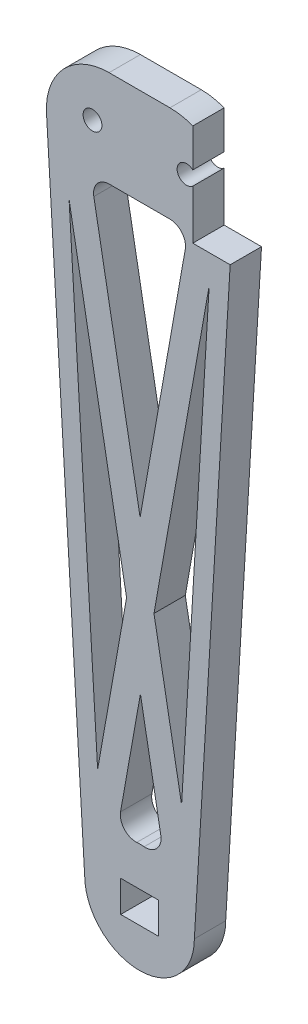
ISO-10303-21;
HEADER;
FILE_DESCRIPTION(('STEP AP214'),'2;1');
FILE_NAME('part.step','',(''),(''),'','','');
FILE_SCHEMA(('AUTOMOTIVE_DESIGN { 1 0 10303 214 1 1 1 1 }'));
ENDSEC;
DATA;
#1=APPLICATION_CONTEXT('core data for automotive mechanical design processes');
#2=APPLICATION_PROTOCOL_DEFINITION('international standard','automotive_design',2000,#1);
#3=PRODUCT_CONTEXT('',#1,'mechanical');
#4=PRODUCT('Part','Part','',(#3));
#5=PRODUCT_RELATED_PRODUCT_CATEGORY('part','',(#4));
#6=PRODUCT_DEFINITION_FORMATION('','',#4);
#7=PRODUCT_DEFINITION_CONTEXT('part definition',#1,'design');
#8=PRODUCT_DEFINITION('design','',#6,#7);
#9=PRODUCT_DEFINITION_SHAPE('','',#8);
#10=(LENGTH_UNIT() NAMED_UNIT(*) SI_UNIT(.MILLI.,.METRE.));
#11=(NAMED_UNIT(*) PLANE_ANGLE_UNIT() SI_UNIT($,.RADIAN.));
#12=(NAMED_UNIT(*) SI_UNIT($,.STERADIAN.) SOLID_ANGLE_UNIT());
#13=UNCERTAINTY_MEASURE_WITH_UNIT(LENGTH_MEASURE(1.E-05),#10,'distance_accuracy_value','');
#14=(GEOMETRIC_REPRESENTATION_CONTEXT(3) GLOBAL_UNCERTAINTY_ASSIGNED_CONTEXT((#13)) GLOBAL_UNIT_ASSIGNED_CONTEXT((#10,
#11,#12)) REPRESENTATION_CONTEXT('',''));
#15=CARTESIAN_POINT('',(0.,0.,0.));
#16=DIRECTION('',(0.,0.,1.));
#17=DIRECTION('',(1.,0.,0.));
#18=AXIS2_PLACEMENT_3D('',#15,#16,#17);
#19=CARTESIAN_POINT('',(0.,0.,10.));
#20=DIRECTION('',(0.,0.,1.));
#21=DIRECTION('',(1.,0.,0.));
#22=AXIS2_PLACEMENT_3D('',#19,#20,#21);
#23=PLANE('',#22);
#24=CARTESIAN_POINT('',(-15.,0.,10.));
#25=DIRECTION('',(0.,0.,1.));
#26=DIRECTION('',(1.,0.,0.));
#27=AXIS2_PLACEMENT_3D('',#24,#25,#26);
#28=CIRCLE('',#27,3.);
#29=CARTESIAN_POINT('',(-12.,0.,10.));
#30=VERTEX_POINT('',#29);
#31=EDGE_CURVE('E441',#30,#30,#28,.T.);
#32=ORIENTED_EDGE('',*,*,#31,.F.);
#33=EDGE_LOOP('',(#32));
#34=FACE_BOUND('',#33,.T.);
#35=DIRECTION('',(0.,1.,0.));
#36=VECTOR('',#35,1.);
#37=CARTESIAN_POINT('',(-6.00000000000001,0.,10.));
#38=LINE('',#37,#36);
#39=CARTESIAN_POINT('',(-6.00000000000001,-215.,10.));
#40=VERTEX_POINT('',#39);
#41=CARTESIAN_POINT('',(-6.00000000000001,-205.,10.));
#42=VERTEX_POINT('',#41);
#43=EDGE_CURVE('E444',#40,#42,#38,.T.);
#44=ORIENTED_EDGE('',*,*,#43,.T.);
#45=DIRECTION('',(1.,0.,0.));
#46=VECTOR('',#45,1.);
#47=CARTESIAN_POINT('',(4.74157750100327E-13,-205.,10.));
#48=LINE('',#47,#46);
#49=CARTESIAN_POINT('',(6.,-205.,10.));
#50=VERTEX_POINT('',#49);
#51=EDGE_CURVE('E447',#42,#50,#48,.T.);
#52=ORIENTED_EDGE('',*,*,#51,.T.);
#53=DIRECTION('',(0.,1.,0.));
#54=VECTOR('',#53,1.);
#55=CARTESIAN_POINT('',(5.99999999999989,0.,10.));
#56=LINE('',#55,#54);
#57=CARTESIAN_POINT('',(6.00000000000001,-215.,10.));
#58=VERTEX_POINT('',#57);
#59=EDGE_CURVE('E449',#58,#50,#56,.T.);
#60=ORIENTED_EDGE('',*,*,#59,.F.);
#61=DIRECTION('',(1.,0.,0.));
#62=VECTOR('',#61,1.);
#63=CARTESIAN_POINT('',(-4.97287396446684E-13,-215.,10.));
#64=LINE('',#63,#62);
#65=EDGE_CURVE('E452',#40,#58,#64,.T.);
#66=ORIENTED_EDGE('',*,*,#65,.F.);
#67=EDGE_LOOP('',(#44,#52,#60,#66));
#68=FACE_BOUND('',#67,.T.);
#69=DIRECTION('',(0.174574666070561,0.984643938673444,0.));
#70=VECTOR('',#69,1.);
#71=CARTESIAN_POINT('',(17.7452712206691,-3.14618785126878,10.));
#72=LINE('',#71,#70);
#73=CARTESIAN_POINT('',(0.190220551076297,-102.160979768059,10.));
#74=VERTEX_POINT('',#73);
#75=CARTESIAN_POINT('',(14.6023785703389,-20.8728733303528,10.));
#76=VERTEX_POINT('',#75);
#77=EDGE_CURVE('E419',#74,#76,#72,.T.);
#78=ORIENTED_EDGE('',*,*,#77,.F.);
#79=DIRECTION('',(-0.178826073356073,0.983880701857724,0.));
#80=VECTOR('',#79,1.);
#81=CARTESIAN_POINT('',(-17.7904251161172,-3.23351384049256,10.));
#82=LINE('',#81,#80);
#83=CARTESIAN_POINT('',(-14.5805047462184,-20.8941303667804,10.));
#84=VERTEX_POINT('',#83);
#85=EDGE_CURVE('E379',#74,#84,#82,.T.);
#86=ORIENTED_EDGE('',*,*,#85,.T.);
#87=CARTESIAN_POINT('',(-9.66110123692979,-20.,10.));
#88=DIRECTION('',(0.,0.,1.));
#89=DIRECTION('',(1.,0.,0.));
#90=AXIS2_PLACEMENT_3D('',#87,#88,#89);
#91=CIRCLE('',#90,5.);
#92=CARTESIAN_POINT('',(-9.66110123692979,-15.,10.));
#93=VERTEX_POINT('',#92);
#94=EDGE_CURVE('E539',#84,#93,#91,.F.);
#95=ORIENTED_EDGE('',*,*,#94,.T.);
#96=DIRECTION('',(1.,0.,0.));
#97=VECTOR('',#96,1.);
#98=CARTESIAN_POINT('',(0.,-15.,10.));
#99=LINE('',#98,#97);
#100=CARTESIAN_POINT('',(9.67915887697167,-15.,10.));
#101=VERTEX_POINT('',#100);
#102=EDGE_CURVE('E410',#93,#101,#99,.T.);
#103=ORIENTED_EDGE('',*,*,#102,.T.);
#104=CARTESIAN_POINT('',(9.67915887697167,-20.,10.));
#105=DIRECTION('',(0.,0.,1.));
#106=DIRECTION('',(1.,0.,0.));
#107=AXIS2_PLACEMENT_3D('',#104,#105,#106);
#108=CIRCLE('',#107,5.);
#109=EDGE_CURVE('E115',#101,#76,#108,.F.);
#110=ORIENTED_EDGE('',*,*,#109,.T.);
#111=EDGE_LOOP('',(#78,#86,#95,#103,#110));
#112=FACE_BOUND('',#111,.T.);
#113=DIRECTION('',(-0.178826073356073,0.983880701857724,0.));
#114=VECTOR('',#113,1.);
#115=CARTESIAN_POINT('',(-26.2678721622271,-4.77433943497515,10.));
#116=LINE('',#115,#114);
#117=CARTESIAN_POINT('',(6.79531038371948,-186.684206595022,10.));
#118=VERTEX_POINT('',#117);
#119=CARTESIAN_POINT('',(0.29160959832128,-150.901585116392,10.));
#120=VERTEX_POINT('',#119);
#121=EDGE_CURVE('E351',#118,#120,#116,.T.);
#122=ORIENTED_EDGE('',*,*,#121,.F.);
#123=CARTESIAN_POINT('',(1.87590687443086,-187.578336961803,10.));
#124=DIRECTION('',(0.,0.,1.));
#125=DIRECTION('',(1.,0.,0.));
#126=AXIS2_PLACEMENT_3D('',#123,#124,#125);
#127=CIRCLE('',#126,5.);
#128=CARTESIAN_POINT('',(1.45903868011289,-192.560928748069,10.));
#129=VERTEX_POINT('',#128);
#130=EDGE_CURVE('E531',#118,#129,#127,.F.);
#131=ORIENTED_EDGE('',*,*,#130,.T.);
#132=CARTESIAN_POINT('',(0.,-210.,10.));
#133=DIRECTION('',(0.,0.,1.));
#134=DIRECTION('',(1.,0.,0.));
#135=AXIS2_PLACEMENT_3D('',#132,#133,#134);
#136=CIRCLE('',#135,17.5);
#137=CARTESIAN_POINT('',(-0.874372767581587,-192.521857299378,10.));
#138=VERTEX_POINT('',#137);
#139=EDGE_CURVE('E332',#129,#138,#136,.T.);
#140=ORIENTED_EDGE('',*,*,#139,.T.);
#141=CARTESIAN_POINT('',(-1.12419355831918,-187.528102242057,10.));
#142=DIRECTION('',(0.,0.,1.));
#143=DIRECTION('',(1.,0.,0.));
#144=AXIS2_PLACEMENT_3D('',#141,#142,#143);
#145=CIRCLE('',#144,5.);
#146=CARTESIAN_POINT('',(-6.0474132516864,-186.655228911704,10.));
#147=VERTEX_POINT('',#146);
#148=EDGE_CURVE('E535',#138,#147,#145,.F.);
#149=ORIENTED_EDGE('',*,*,#148,.T.);
#150=DIRECTION('',(0.174574666070561,0.984643938673444,0.));
#151=VECTOR('',#150,1.);
#152=CARTESIAN_POINT('',(26.2217824014059,-4.64905000346376,10.));
#153=LINE('',#152,#151);
#154=EDGE_CURVE('E343',#147,#120,#153,.T.);
#155=ORIENTED_EDGE('',*,*,#154,.T.);
#156=EDGE_LOOP('',(#122,#131,#140,#149,#155));
#157=FACE_BOUND('',#156,.T.);
#158=DIRECTION('',(-0.178826073356073,0.983880701857724,0.));
#159=VECTOR('',#158,1.);
#160=CARTESIAN_POINT('',(-17.7904251161172,-3.23351384049256,10.));
#161=LINE('',#160,#159);
#162=CARTESIAN_POINT('',(13.4301626709257,-175.005634358752,10.));
#163=VERTEX_POINT('',#162);
#164=CARTESIAN_POINT('',(4.61598635326493,-126.511039476885,10.));
#165=VERTEX_POINT('',#164);
#166=EDGE_CURVE('E395',#163,#165,#161,.T.);
#167=ORIENTED_EDGE('',*,*,#166,.T.);
#168=DIRECTION('',(0.174574666070561,0.984643938673444,0.));
#169=VECTOR('',#168,1.);
#170=CARTESIAN_POINT('',(26.2217824014059,-4.64905000346376,10.));
#171=LINE('',#170,#169);
#172=CARTESIAN_POINT('',(22.2304198411749,-27.1613138985647,10.));
#173=VERTEX_POINT('',#172);
#174=EDGE_CURVE('E357',#165,#173,#171,.T.);
#175=ORIENTED_EDGE('',*,*,#174,.T.);
#176=DIRECTION('',(-0.0594186399842153,-0.998233151734817,0.));
#177=VECTOR('',#176,1.);
#178=CARTESIAN_POINT('',(23.7629705178262,-1.41446253082299,10.));
#179=LINE('',#178,#177);
#180=EDGE_CURVE('E387',#173,#163,#179,.T.);
#181=ORIENTED_EDGE('',*,*,#180,.T.);
#182=EDGE_LOOP('',(#167,#175,#181));
#183=FACE_BOUND('',#182,.T.);
#184=DIRECTION('',(0.174574666070561,0.984643938673444,0.));
#185=VECTOR('',#184,1.);
#186=CARTESIAN_POINT('',(17.7452712206691,-3.14618785126878,10.));
#187=LINE('',#186,#185);
#188=CARTESIAN_POINT('',(-13.367328464566,-178.628881795291,10.));
#189=VERTEX_POINT('',#188);
#190=CARTESIAN_POINT('',(-4.13415620386734,-126.551525407566,10.));
#191=VERTEX_POINT('',#190);
#192=EDGE_CURVE('E371',#189,#191,#187,.T.);
#193=ORIENTED_EDGE('',*,*,#192,.F.);
#194=DIRECTION('',(-0.0594186399842153,0.998233151734817,0.));
#195=VECTOR('',#194,1.);
#196=CARTESIAN_POINT('',(-23.9152662053382,-1.42352775031775,10.));
#197=LINE('',#196,#195);
#198=CARTESIAN_POINT('',(-22.4730270714025,-25.6531452004381,10.));
#199=VERTEX_POINT('',#198);
#200=EDGE_CURVE('E368',#189,#199,#197,.T.);
#201=ORIENTED_EDGE('',*,*,#200,.T.);
#202=DIRECTION('',(-0.178826073356073,0.983880701857724,0.));
#203=VECTOR('',#202,1.);
#204=CARTESIAN_POINT('',(-26.2678721622271,-4.77433943497515,10.));
#205=LINE('',#204,#203);
#206=EDGE_CURVE('E361',#191,#199,#205,.T.);
#207=ORIENTED_EDGE('',*,*,#206,.F.);
#208=EDGE_LOOP('',(#193,#201,#207));
#209=FACE_BOUND('',#208,.T.);
#210=CARTESIAN_POINT('',(15.,0.,10.));
#211=DIRECTION('',(0.,0.,1.));
#212=DIRECTION('',(1.,0.,0.));
#213=AXIS2_PLACEMENT_3D('',#210,#211,#212);
#214=CIRCLE('',#213,3.);
#215=CARTESIAN_POINT('',(17.,2.23606797749979,10.));
#216=VERTEX_POINT('',#215);
#217=CARTESIAN_POINT('',(17.,-2.23606797749979,10.));
#218=VERTEX_POINT('',#217);
#219=EDGE_CURVE('E438',#216,#218,#214,.T.);
#220=ORIENTED_EDGE('',*,*,#219,.F.);
#221=DIRECTION('',(0.,1.,0.));
#222=VECTOR('',#221,1.);
#223=CARTESIAN_POINT('',(17.,0.,10.));
#224=LINE('',#223,#222);
#225=CARTESIAN_POINT('',(17.,14.395591770238,10.));
#226=VERTEX_POINT('',#225);
#227=EDGE_CURVE('E321',#216,#226,#224,.T.);
#228=ORIENTED_EDGE('',*,*,#227,.T.);
#229=CARTESIAN_POINT('',(9.71283934950197,-4.22958714578407,10.));
#230=DIRECTION('',(0.,0.,1.));
#231=DIRECTION('',(1.,0.,0.));
#232=AXIS2_PLACEMENT_3D('',#229,#230,#231);
#233=CIRCLE('',#232,20.);
#234=CARTESIAN_POINT('',(9.71283934950197,15.7704128542159,10.));
#235=VERTEX_POINT('',#234);
#236=EDGE_CURVE('E509',#226,#235,#233,.T.);
#237=ORIENTED_EDGE('',*,*,#236,.T.);
#238=DIRECTION('',(1.,0.,0.));
#239=VECTOR('',#238,1.);
#240=CARTESIAN_POINT('',(0.,15.7704128542159,10.));
#241=LINE('',#240,#239);
#242=CARTESIAN_POINT('',(-9.71283934950197,15.7704128542159,10.));
#243=VERTEX_POINT('',#242);
#244=EDGE_CURVE('E435',#243,#235,#241,.T.);
#245=ORIENTED_EDGE('',*,*,#244,.F.);
#246=CARTESIAN_POINT('',(-9.71283934950197,-4.22958714578407,10.));
#247=DIRECTION('',(0.,0.,1.));
#248=DIRECTION('',(1.,0.,0.));
#249=AXIS2_PLACEMENT_3D('',#246,#247,#248);
#250=CIRCLE('',#249,20.);
#251=CARTESIAN_POINT('',(-29.6775023841983,-5.41795994546837,10.));
#252=VERTEX_POINT('',#251);
#253=EDGE_CURVE('E501',#243,#252,#250,.T.);
#254=ORIENTED_EDGE('',*,*,#253,.T.);
#255=DIRECTION('',(0.0594186399842153,-0.998233151734817,0.));
#256=VECTOR('',#255,1.);
#257=CARTESIAN_POINT('',(-29.8940827566728,-1.77940968789719,10.));
#258=LINE('',#257,#256);
#259=CARTESIAN_POINT('',(-17.5,-210.,10.));
#260=VERTEX_POINT('',#259);
#261=EDGE_CURVE('E427',#252,#260,#258,.T.);
#262=ORIENTED_EDGE('',*,*,#261,.T.);
#263=CARTESIAN_POINT('',(0.,-210.,10.));
#264=DIRECTION('',(0.,0.,1.));
#265=DIRECTION('',(1.,0.,0.));
#266=AXIS2_PLACEMENT_3D('',#263,#264,#265);
#267=CIRCLE('',#266,17.5);
#268=CARTESIAN_POINT('',(17.5,-210.,10.));
#269=VERTEX_POINT('',#268);
#270=EDGE_CURVE('E429',#260,#269,#267,.T.);
#271=ORIENTED_EDGE('',*,*,#270,.T.);
#272=DIRECTION('',(-0.0594186399842153,-0.998233151734817,0.));
#273=VECTOR('',#272,1.);
#274=CARTESIAN_POINT('',(29.8940827566728,-1.77940968789719,10.));
#275=LINE('',#274,#273);
#276=CARTESIAN_POINT('',(28.9285714285714,-18.,10.));
#277=VERTEX_POINT('',#276);
#278=EDGE_CURVE('E433',#277,#269,#275,.T.);
#279=ORIENTED_EDGE('',*,*,#278,.F.);
#280=DIRECTION('',(1.,0.,0.));
#281=VECTOR('',#280,1.);
#282=CARTESIAN_POINT('',(0.,-18.,10.));
#283=LINE('',#282,#281);
#284=CARTESIAN_POINT('',(17.,-18.,10.));
#285=VERTEX_POINT('',#284);
#286=EDGE_CURVE('E324',#285,#277,#283,.T.);
#287=ORIENTED_EDGE('',*,*,#286,.F.);
#288=DIRECTION('',(0.,1.,0.));
#289=VECTOR('',#288,1.);
#290=CARTESIAN_POINT('',(17.,0.,10.));
#291=LINE('',#290,#289);
#292=EDGE_CURVE('E305',#285,#218,#291,.T.);
#293=ORIENTED_EDGE('',*,*,#292,.T.);
#294=EDGE_LOOP('',(#220,#228,#237,#245,#254,#262,#271,#279,#287,#293));
#295=FACE_BOUND('',#294,.T.);
#296=ADVANCED_FACE('F107',(#34,#68,#112,#157,#183,#209,#295),#23,.T.);
#297=CARTESIAN_POINT('',(0.,0.,0.));
#298=DIRECTION('',(0.,0.,1.));
#299=DIRECTION('',(1.,0.,0.));
#300=AXIS2_PLACEMENT_3D('',#297,#298,#299);
#301=PLANE('',#300);
#302=DIRECTION('',(-0.0594186399842153,0.998233151734817,0.));
#303=VECTOR('',#302,1.);
#304=CARTESIAN_POINT('',(-23.9152662053382,-1.42352775031775,0.));
#305=LINE('',#304,#303);
#306=CARTESIAN_POINT('',(-13.367328464566,-178.628881795291,0.));
#307=VERTEX_POINT('',#306);
#308=CARTESIAN_POINT('',(-22.4730270714025,-25.6531452004381,0.));
#309=VERTEX_POINT('',#308);
#310=EDGE_CURVE('E358',#307,#309,#305,.T.);
#311=ORIENTED_EDGE('',*,*,#310,.F.);
#312=DIRECTION('',(0.174574666070561,0.984643938673444,0.));
#313=VECTOR('',#312,1.);
#314=CARTESIAN_POINT('',(17.7452712206691,-3.14618785126878,0.));
#315=LINE('',#314,#313);
#316=CARTESIAN_POINT('',(-4.13415620386734,-126.551525407566,0.));
#317=VERTEX_POINT('',#316);
#318=EDGE_CURVE('E360',#307,#317,#315,.T.);
#319=ORIENTED_EDGE('',*,*,#318,.T.);
#320=DIRECTION('',(-0.178826073356073,0.983880701857724,0.));
#321=VECTOR('',#320,1.);
#322=CARTESIAN_POINT('',(-26.2678721622271,-4.77433943497515,0.));
#323=LINE('',#322,#321);
#324=EDGE_CURVE('E364',#317,#309,#323,.T.);
#325=ORIENTED_EDGE('',*,*,#324,.T.);
#326=EDGE_LOOP('',(#311,#319,#325));
#327=FACE_BOUND('',#326,.T.);
#328=CARTESIAN_POINT('',(0.,-210.,0.));
#329=DIRECTION('',(0.,0.,1.));
#330=DIRECTION('',(1.,0.,0.));
#331=AXIS2_PLACEMENT_3D('',#328,#329,#330);
#332=CIRCLE('',#331,17.5);
#333=CARTESIAN_POINT('',(1.45903868011289,-192.560928748069,0.));
#334=VERTEX_POINT('',#333);
#335=CARTESIAN_POINT('',(-0.874372767581587,-192.521857299378,0.));
#336=VERTEX_POINT('',#335);
#337=EDGE_CURVE('E339',#334,#336,#332,.T.);
#338=ORIENTED_EDGE('',*,*,#337,.F.);
#339=CARTESIAN_POINT('',(1.87590687443086,-187.578336961803,0.));
#340=DIRECTION('',(0.,0.,1.));
#341=DIRECTION('',(1.,0.,0.));
#342=AXIS2_PLACEMENT_3D('',#339,#340,#341);
#343=CIRCLE('',#342,5.);
#344=CARTESIAN_POINT('',(6.79531038371948,-186.684206595022,0.));
#345=VERTEX_POINT('',#344);
#346=EDGE_CURVE('E533',#334,#345,#343,.T.);
#347=ORIENTED_EDGE('',*,*,#346,.T.);
#348=DIRECTION('',(-0.178826073356073,0.983880701857724,0.));
#349=VECTOR('',#348,1.);
#350=CARTESIAN_POINT('',(-26.2678721622271,-4.77433943497515,0.));
#351=LINE('',#350,#349);
#352=CARTESIAN_POINT('',(0.291609598321283,-150.901585116392,0.));
#353=VERTEX_POINT('',#352);
#354=EDGE_CURVE('E342',#345,#353,#351,.T.);
#355=ORIENTED_EDGE('',*,*,#354,.T.);
#356=DIRECTION('',(0.174574666070561,0.984643938673444,0.));
#357=VECTOR('',#356,1.);
#358=CARTESIAN_POINT('',(26.2217824014059,-4.64905000346376,0.));
#359=LINE('',#358,#357);
#360=CARTESIAN_POINT('',(-6.0474132516864,-186.655228911704,0.));
#361=VERTEX_POINT('',#360);
#362=EDGE_CURVE('E346',#361,#353,#359,.T.);
#363=ORIENTED_EDGE('',*,*,#362,.F.);
#364=CARTESIAN_POINT('',(-1.12419355831918,-187.528102242057,0.));
#365=DIRECTION('',(0.,0.,1.));
#366=DIRECTION('',(1.,0.,0.));
#367=AXIS2_PLACEMENT_3D('',#364,#365,#366);
#368=CIRCLE('',#367,5.);
#369=EDGE_CURVE('E537',#361,#336,#368,.T.);
#370=ORIENTED_EDGE('',*,*,#369,.T.);
#371=EDGE_LOOP('',(#338,#347,#355,#363,#370));
#372=FACE_BOUND('',#371,.T.);
#373=DIRECTION('',(0.,1.,0.));
#374=VECTOR('',#373,1.);
#375=CARTESIAN_POINT('',(-6.00000000000001,0.,0.));
#376=LINE('',#375,#374);
#377=CARTESIAN_POINT('',(-6.00000000000001,-215.,0.));
#378=VERTEX_POINT('',#377);
#379=CARTESIAN_POINT('',(-6.00000000000001,-205.,0.));
#380=VERTEX_POINT('',#379);
#381=EDGE_CURVE('E469',#378,#380,#376,.T.);
#382=ORIENTED_EDGE('',*,*,#381,.F.);
#383=DIRECTION('',(1.,0.,0.));
#384=VECTOR('',#383,1.);
#385=CARTESIAN_POINT('',(-4.97287396446684E-13,-215.,0.));
#386=LINE('',#385,#384);
#387=CARTESIAN_POINT('',(6.00000000000001,-215.,0.));
#388=VERTEX_POINT('',#387);
#389=EDGE_CURVE('E430',#378,#388,#386,.T.);
#390=ORIENTED_EDGE('',*,*,#389,.T.);
#391=DIRECTION('',(0.,1.,0.));
#392=VECTOR('',#391,1.);
#393=CARTESIAN_POINT('',(5.99999999999989,0.,0.));
#394=LINE('',#393,#392);
#395=CARTESIAN_POINT('',(6.,-205.,0.));
#396=VERTEX_POINT('',#395);
#397=EDGE_CURVE('E475',#388,#396,#394,.T.);
#398=ORIENTED_EDGE('',*,*,#397,.T.);
#399=DIRECTION('',(1.,0.,0.));
#400=VECTOR('',#399,1.);
#401=CARTESIAN_POINT('',(4.74157750100327E-13,-205.,0.));
#402=LINE('',#401,#400);
#403=EDGE_CURVE('E472',#380,#396,#402,.T.);
#404=ORIENTED_EDGE('',*,*,#403,.F.);
#405=EDGE_LOOP('',(#382,#390,#398,#404));
#406=FACE_BOUND('',#405,.T.);
#407=CARTESIAN_POINT('',(-15.,0.,0.));
#408=DIRECTION('',(0.,0.,1.));
#409=DIRECTION('',(1.,0.,0.));
#410=AXIS2_PLACEMENT_3D('',#407,#408,#409);
#411=CIRCLE('',#410,3.);
#412=CARTESIAN_POINT('',(-12.,0.,0.));
#413=VERTEX_POINT('',#412);
#414=EDGE_CURVE('E466',#413,#413,#411,.T.);
#415=ORIENTED_EDGE('',*,*,#414,.T.);
#416=EDGE_LOOP('',(#415));
#417=FACE_BOUND('',#416,.T.);
#418=DIRECTION('',(-0.178826073356073,0.983880701857724,0.));
#419=VECTOR('',#418,1.);
#420=CARTESIAN_POINT('',(-17.7904251161172,-3.23351384049256,0.));
#421=LINE('',#420,#419);
#422=CARTESIAN_POINT('',(0.190220551076304,-102.160979768059,0.));
#423=VERTEX_POINT('',#422);
#424=CARTESIAN_POINT('',(-14.5805047462184,-20.8941303667804,0.));
#425=VERTEX_POINT('',#424);
#426=EDGE_CURVE('E406',#423,#425,#421,.T.);
#427=ORIENTED_EDGE('',*,*,#426,.F.);
#428=DIRECTION('',(0.174574666070561,0.984643938673444,0.));
#429=VECTOR('',#428,1.);
#430=CARTESIAN_POINT('',(17.7452712206691,-3.14618785126878,0.));
#431=LINE('',#430,#429);
#432=CARTESIAN_POINT('',(14.6023785703389,-20.8728733303528,0.));
#433=VERTEX_POINT('',#432);
#434=EDGE_CURVE('E409',#423,#433,#431,.T.);
#435=ORIENTED_EDGE('',*,*,#434,.T.);
#436=CARTESIAN_POINT('',(9.67915887697167,-20.,0.));
#437=DIRECTION('',(0.,0.,1.));
#438=DIRECTION('',(1.,0.,0.));
#439=AXIS2_PLACEMENT_3D('',#436,#437,#438);
#440=CIRCLE('',#439,5.);
#441=CARTESIAN_POINT('',(9.67915887697167,-15.,0.));
#442=VERTEX_POINT('',#441);
#443=EDGE_CURVE('E12',#433,#442,#440,.T.);
#444=ORIENTED_EDGE('',*,*,#443,.T.);
#445=DIRECTION('',(1.,0.,0.));
#446=VECTOR('',#445,1.);
#447=CARTESIAN_POINT('',(0.,-15.,0.));
#448=LINE('',#447,#446);
#449=CARTESIAN_POINT('',(-9.66110123692979,-15.,0.));
#450=VERTEX_POINT('',#449);
#451=EDGE_CURVE('E413',#450,#442,#448,.T.);
#452=ORIENTED_EDGE('',*,*,#451,.F.);
#453=CARTESIAN_POINT('',(-9.66110123692979,-20.,0.));
#454=DIRECTION('',(0.,0.,1.));
#455=DIRECTION('',(1.,0.,0.));
#456=AXIS2_PLACEMENT_3D('',#453,#454,#455);
#457=CIRCLE('',#456,5.);
#458=EDGE_CURVE('E541',#450,#425,#457,.T.);
#459=ORIENTED_EDGE('',*,*,#458,.T.);
#460=EDGE_LOOP('',(#427,#435,#444,#452,#459));
#461=FACE_BOUND('',#460,.T.);
#462=DIRECTION('',(0.174574666070561,0.984643938673444,0.));
#463=VECTOR('',#462,1.);
#464=CARTESIAN_POINT('',(26.2217824014059,-4.64905000346376,0.));
#465=LINE('',#464,#463);
#466=CARTESIAN_POINT('',(4.61598635326493,-126.511039476885,0.));
#467=VERTEX_POINT('',#466);
#468=CARTESIAN_POINT('',(22.2304198411749,-27.1613138985647,0.));
#469=VERTEX_POINT('',#468);
#470=EDGE_CURVE('E384',#467,#469,#465,.T.);
#471=ORIENTED_EDGE('',*,*,#470,.F.);
#472=DIRECTION('',(-0.178826073356073,0.983880701857724,0.));
#473=VECTOR('',#472,1.);
#474=CARTESIAN_POINT('',(-17.7904251161172,-3.23351384049256,0.));
#475=LINE('',#474,#473);
#476=CARTESIAN_POINT('',(13.4301626709257,-175.005634358752,0.));
#477=VERTEX_POINT('',#476);
#478=EDGE_CURVE('E386',#477,#467,#475,.T.);
#479=ORIENTED_EDGE('',*,*,#478,.F.);
#480=DIRECTION('',(-0.0594186399842153,-0.998233151734817,0.));
#481=VECTOR('',#480,1.);
#482=CARTESIAN_POINT('',(23.7629705178262,-1.41446253082299,0.));
#483=LINE('',#482,#481);
#484=EDGE_CURVE('E389',#469,#477,#483,.T.);
#485=ORIENTED_EDGE('',*,*,#484,.F.);
#486=EDGE_LOOP('',(#471,#479,#485));
#487=FACE_BOUND('',#486,.T.);
#488=DIRECTION('',(0.,1.,0.));
#489=VECTOR('',#488,1.);
#490=CARTESIAN_POINT('',(17.,0.,0.));
#491=LINE('',#490,#489);
#492=CARTESIAN_POINT('',(17.,2.23606797749979,0.));
#493=VERTEX_POINT('',#492);
#494=CARTESIAN_POINT('',(17.,14.395591770238,0.));
#495=VERTEX_POINT('',#494);
#496=EDGE_CURVE('E130',#493,#495,#491,.T.);
#497=ORIENTED_EDGE('',*,*,#496,.F.);
#498=CARTESIAN_POINT('',(15.,0.,0.));
#499=DIRECTION('',(0.,0.,1.));
#500=DIRECTION('',(1.,0.,0.));
#501=AXIS2_PLACEMENT_3D('',#498,#499,#500);
#502=CIRCLE('',#501,3.);
#503=CARTESIAN_POINT('',(17.,-2.23606797749979,0.));
#504=VERTEX_POINT('',#503);
#505=EDGE_CURVE('E320',#493,#504,#502,.T.);
#506=ORIENTED_EDGE('',*,*,#505,.T.);
#507=DIRECTION('',(0.,1.,0.));
#508=VECTOR('',#507,1.);
#509=CARTESIAN_POINT('',(17.,0.,0.));
#510=LINE('',#509,#508);
#511=CARTESIAN_POINT('',(17.,-18.,0.));
#512=VERTEX_POINT('',#511);
#513=EDGE_CURVE('E122',#512,#504,#510,.T.);
#514=ORIENTED_EDGE('',*,*,#513,.F.);
#515=DIRECTION('',(1.,0.,0.));
#516=VECTOR('',#515,1.);
#517=CARTESIAN_POINT('',(0.,-18.,0.));
#518=LINE('',#517,#516);
#519=CARTESIAN_POINT('',(28.9285714285714,-18.,0.));
#520=VERTEX_POINT('',#519);
#521=EDGE_CURVE('E311',#512,#520,#518,.T.);
#522=ORIENTED_EDGE('',*,*,#521,.T.);
#523=DIRECTION('',(-0.0594186399842153,-0.998233151734817,0.));
#524=VECTOR('',#523,1.);
#525=CARTESIAN_POINT('',(29.8940827566728,-1.77940968789719,0.));
#526=LINE('',#525,#524);
#527=CARTESIAN_POINT('',(17.5,-210.,0.));
#528=VERTEX_POINT('',#527);
#529=EDGE_CURVE('E460',#520,#528,#526,.T.);
#530=ORIENTED_EDGE('',*,*,#529,.T.);
#531=CARTESIAN_POINT('',(0.,-210.,0.));
#532=DIRECTION('',(0.,0.,1.));
#533=DIRECTION('',(1.,0.,0.));
#534=AXIS2_PLACEMENT_3D('',#531,#532,#533);
#535=CIRCLE('',#534,17.5);
#536=CARTESIAN_POINT('',(-17.5,-210.,0.));
#537=VERTEX_POINT('',#536);
#538=EDGE_CURVE('E457',#537,#528,#535,.T.);
#539=ORIENTED_EDGE('',*,*,#538,.F.);
#540=DIRECTION('',(0.0594186399842153,-0.998233151734817,0.));
#541=VECTOR('',#540,1.);
#542=CARTESIAN_POINT('',(-29.8940827566728,-1.77940968789719,0.));
#543=LINE('',#542,#541);
#544=CARTESIAN_POINT('',(-29.6775023841983,-5.41795994546837,0.));
#545=VERTEX_POINT('',#544);
#546=EDGE_CURVE('E426',#545,#537,#543,.T.);
#547=ORIENTED_EDGE('',*,*,#546,.F.);
#548=CARTESIAN_POINT('',(-9.71283934950197,-4.22958714578407,0.));
#549=DIRECTION('',(0.,0.,1.));
#550=DIRECTION('',(1.,0.,0.));
#551=AXIS2_PLACEMENT_3D('',#548,#549,#550);
#552=CIRCLE('',#551,20.);
#553=CARTESIAN_POINT('',(-9.71283934950197,15.7704128542159,0.));
#554=VERTEX_POINT('',#553);
#555=EDGE_CURVE('E497',#545,#554,#552,.F.);
#556=ORIENTED_EDGE('',*,*,#555,.T.);
#557=DIRECTION('',(1.,0.,0.));
#558=VECTOR('',#557,1.);
#559=CARTESIAN_POINT('',(0.,15.7704128542159,0.));
#560=LINE('',#559,#558);
#561=CARTESIAN_POINT('',(9.71283934950197,15.7704128542159,0.));
#562=VERTEX_POINT('',#561);
#563=EDGE_CURVE('E462',#554,#562,#560,.T.);
#564=ORIENTED_EDGE('',*,*,#563,.T.);
#565=CARTESIAN_POINT('',(9.71283934950197,-4.22958714578407,0.));
#566=DIRECTION('',(0.,0.,1.));
#567=DIRECTION('',(1.,0.,0.));
#568=AXIS2_PLACEMENT_3D('',#565,#566,#567);
#569=CIRCLE('',#568,20.);
#570=EDGE_CURVE('E506',#562,#495,#569,.F.);
#571=ORIENTED_EDGE('',*,*,#570,.T.);
#572=EDGE_LOOP('',(#497,#506,#514,#522,#530,#539,#547,#556,#564,#571));
#573=FACE_BOUND('',#572,.T.);
#574=ADVANCED_FACE('F318',(#327,#372,#406,#417,#461,#487,#573),#301,.F.);
#575=CARTESIAN_POINT('',(15.,0.,10.));
#576=DIRECTION('',(0.,0.,-1.));
#577=DIRECTION('',(-1.,0.,0.));
#578=AXIS2_PLACEMENT_3D('',#575,#576,#577);
#579=CYLINDRICAL_SURFACE('',#578,3.);
#580=ORIENTED_EDGE('',*,*,#219,.T.);
#581=DIRECTION('',(0.,0.,1.));
#582=VECTOR('',#581,1.);
#583=CARTESIAN_POINT('',(17.,-2.23606797749979,0.));
#584=LINE('',#583,#582);
#585=EDGE_CURVE('E330',#504,#218,#584,.T.);
#586=ORIENTED_EDGE('',*,*,#585,.F.);
#587=ORIENTED_EDGE('',*,*,#505,.F.);
#588=DIRECTION('',(0.,0.,1.));
#589=VECTOR('',#588,1.);
#590=CARTESIAN_POINT('',(17.,2.23606797749979,0.));
#591=LINE('',#590,#589);
#592=EDGE_CURVE('E333',#493,#216,#591,.T.);
#593=ORIENTED_EDGE('',*,*,#592,.T.);
#594=EDGE_LOOP('',(#580,#586,#587,#593));
#595=FACE_BOUND('',#594,.T.);
#596=ADVANCED_FACE('F586',(#595),#579,.F.);
#597=CARTESIAN_POINT('',(9.71283934950197,-4.22958714578407,10.));
#598=DIRECTION('',(0.,0.,-1.));
#599=DIRECTION('',(-1.,0.,0.));
#600=AXIS2_PLACEMENT_3D('',#597,#598,#599);
#601=CYLINDRICAL_SURFACE('',#600,20.);
#602=ORIENTED_EDGE('',*,*,#236,.F.);
#603=DIRECTION('',(0.,0.,1.));
#604=VECTOR('',#603,1.);
#605=CARTESIAN_POINT('',(17.,14.395591770238,0.));
#606=LINE('',#605,#604);
#607=EDGE_CURVE('E336',#495,#226,#606,.T.);
#608=ORIENTED_EDGE('',*,*,#607,.F.);
#609=ORIENTED_EDGE('',*,*,#570,.F.);
#610=DIRECTION('',(0.,0.,-1.));
#611=VECTOR('',#610,1.);
#612=CARTESIAN_POINT('',(9.71283934950197,15.7704128542159,10.));
#613=LINE('',#612,#611);
#614=EDGE_CURVE('E503',#235,#562,#613,.T.);
#615=ORIENTED_EDGE('',*,*,#614,.F.);
#616=EDGE_LOOP('',(#602,#608,#609,#615));
#617=FACE_BOUND('',#616,.T.);
#618=ADVANCED_FACE('F608',(#617),#601,.T.);
#619=CARTESIAN_POINT('',(-6.00000000000001,0.,10.));
#620=DIRECTION('',(-1.,0.,0.));
#621=DIRECTION('',(0.,0.,1.));
#622=AXIS2_PLACEMENT_3D('',#619,#620,#621);
#623=PLANE('',#622);
#624=ORIENTED_EDGE('',*,*,#381,.T.);
#625=DIRECTION('',(0.,0.,-1.));
#626=VECTOR('',#625,1.);
#627=CARTESIAN_POINT('',(-6.00000000000001,-205.,10.));
#628=LINE('',#627,#626);
#629=EDGE_CURVE('E487',#42,#380,#628,.T.);
#630=ORIENTED_EDGE('',*,*,#629,.F.);
#631=ORIENTED_EDGE('',*,*,#43,.F.);
#632=DIRECTION('',(0.,0.,-1.));
#633=VECTOR('',#632,1.);
#634=CARTESIAN_POINT('',(-6.00000000000001,-215.,10.));
#635=LINE('',#634,#633);
#636=EDGE_CURVE('E480',#40,#378,#635,.T.);
#637=ORIENTED_EDGE('',*,*,#636,.T.);
#638=EDGE_LOOP('',(#624,#630,#631,#637));
#639=FACE_BOUND('',#638,.T.);
#640=ADVANCED_FACE('F604',(#639),#623,.F.);
#641=CARTESIAN_POINT('',(4.74157750100327E-13,-205.,10.));
#642=DIRECTION('',(0.,1.,0.));
#643=DIRECTION('',(-1.,0.,0.));
#644=AXIS2_PLACEMENT_3D('',#641,#642,#643);
#645=PLANE('',#644);
#646=ORIENTED_EDGE('',*,*,#403,.T.);
#647=DIRECTION('',(0.,0.,-1.));
#648=VECTOR('',#647,1.);
#649=CARTESIAN_POINT('',(6.,-205.,10.));
#650=LINE('',#649,#648);
#651=EDGE_CURVE('E485',#50,#396,#650,.T.);
#652=ORIENTED_EDGE('',*,*,#651,.F.);
#653=ORIENTED_EDGE('',*,*,#51,.F.);
#654=ORIENTED_EDGE('',*,*,#629,.T.);
#655=EDGE_LOOP('',(#646,#652,#653,#654));
#656=FACE_BOUND('',#655,.T.);
#657=ADVANCED_FACE('F600',(#656),#645,.F.);
#658=CARTESIAN_POINT('',(5.99999999999989,0.,10.));
#659=DIRECTION('',(-1.,0.,0.));
#660=DIRECTION('',(0.,-1.,0.));
#661=AXIS2_PLACEMENT_3D('',#658,#659,#660);
#662=PLANE('',#661);
#663=ORIENTED_EDGE('',*,*,#397,.F.);
#664=DIRECTION('',(0.,0.,-1.));
#665=VECTOR('',#664,1.);
#666=CARTESIAN_POINT('',(6.00000000000001,-215.,10.));
#667=LINE('',#666,#665);
#668=EDGE_CURVE('E482',#58,#388,#667,.T.);
#669=ORIENTED_EDGE('',*,*,#668,.F.);
#670=ORIENTED_EDGE('',*,*,#59,.T.);
#671=ORIENTED_EDGE('',*,*,#651,.T.);
#672=EDGE_LOOP('',(#663,#669,#670,#671));
#673=FACE_BOUND('',#672,.T.);
#674=ADVANCED_FACE('F596',(#673),#662,.T.);
#675=CARTESIAN_POINT('',(-29.8940827566728,-1.77940968789719,10.));
#676=DIRECTION('',(0.998233151734817,0.0594186399842152,0.));
#677=DIRECTION('',(-0.0594186399842152,0.998233151734817,0.));
#678=AXIS2_PLACEMENT_3D('',#675,#676,#677);
#679=PLANE('',#678);
#680=ORIENTED_EDGE('',*,*,#261,.F.);
#681=DIRECTION('',(0.,0.,-1.));
#682=VECTOR('',#681,1.);
#683=CARTESIAN_POINT('',(-29.6775023841983,-5.41795994546837,0.));
#684=LINE('',#683,#682);
#685=EDGE_CURVE('E490',#252,#545,#684,.T.);
#686=ORIENTED_EDGE('',*,*,#685,.T.);
#687=ORIENTED_EDGE('',*,*,#546,.T.);
#688=DIRECTION('',(0.,0.,-1.));
#689=VECTOR('',#688,1.);
#690=CARTESIAN_POINT('',(-17.5,-210.,10.));
#691=LINE('',#690,#689);
#692=EDGE_CURVE('E483',#260,#537,#691,.T.);
#693=ORIENTED_EDGE('',*,*,#692,.F.);
#694=EDGE_LOOP('',(#680,#686,#687,#693));
#695=FACE_BOUND('',#694,.T.);
#696=ADVANCED_FACE('F599',(#695),#679,.F.);
#697=CARTESIAN_POINT('',(0.,-210.,10.));
#698=DIRECTION('',(0.,0.,-1.));
#699=DIRECTION('',(-1.,0.,0.));
#700=AXIS2_PLACEMENT_3D('',#697,#698,#699);
#701=CYLINDRICAL_SURFACE('',#700,17.5);
#702=ORIENTED_EDGE('',*,*,#538,.T.);
#703=DIRECTION('',(0.,0.,-1.));
#704=VECTOR('',#703,1.);
#705=CARTESIAN_POINT('',(17.5,-210.,10.));
#706=LINE('',#705,#704);
#707=EDGE_CURVE('E455',#269,#528,#706,.T.);
#708=ORIENTED_EDGE('',*,*,#707,.F.);
#709=ORIENTED_EDGE('',*,*,#270,.F.);
#710=ORIENTED_EDGE('',*,*,#692,.T.);
#711=EDGE_LOOP('',(#702,#708,#709,#710));
#712=FACE_BOUND('',#711,.T.);
#713=ADVANCED_FACE('F623',(#712),#701,.T.);
#714=CARTESIAN_POINT('',(29.8940827566728,-1.77940968789719,10.));
#715=DIRECTION('',(0.998233151734817,-0.0594186399842152,0.));
#716=DIRECTION('',(0.0594186399842152,0.998233151734817,0.));
#717=AXIS2_PLACEMENT_3D('',#714,#715,#716);
#718=PLANE('',#717);
#719=DIRECTION('',(0.,0.,1.));
#720=VECTOR('',#719,1.);
#721=CARTESIAN_POINT('',(28.9285714285714,-18.,0.));
#722=LINE('',#721,#720);
#723=EDGE_CURVE('E308',#520,#277,#722,.T.);
#724=ORIENTED_EDGE('',*,*,#723,.T.);
#725=ORIENTED_EDGE('',*,*,#278,.T.);
#726=ORIENTED_EDGE('',*,*,#707,.T.);
#727=ORIENTED_EDGE('',*,*,#529,.F.);
#728=EDGE_LOOP('',(#724,#725,#726,#727));
#729=FACE_BOUND('',#728,.T.);
#730=ADVANCED_FACE('F619',(#729),#718,.T.);
#731=CARTESIAN_POINT('',(0.,15.7704128542159,10.));
#732=DIRECTION('',(0.,1.,0.));
#733=DIRECTION('',(0.,0.,1.));
#734=AXIS2_PLACEMENT_3D('',#731,#732,#733);
#735=PLANE('',#734);
#736=ORIENTED_EDGE('',*,*,#244,.T.);
#737=ORIENTED_EDGE('',*,*,#614,.T.);
#738=ORIENTED_EDGE('',*,*,#563,.F.);
#739=DIRECTION('',(0.,0.,-1.));
#740=VECTOR('',#739,1.);
#741=CARTESIAN_POINT('',(-9.71283934950197,15.7704128542159,10.));
#742=LINE('',#741,#740);
#743=EDGE_CURVE('E499',#554,#243,#742,.F.);
#744=ORIENTED_EDGE('',*,*,#743,.T.);
#745=EDGE_LOOP('',(#736,#737,#738,#744));
#746=FACE_BOUND('',#745,.T.);
#747=ADVANCED_FACE('F612',(#746),#735,.T.);
#748=CARTESIAN_POINT('',(-15.,0.,10.));
#749=DIRECTION('',(0.,0.,-1.));
#750=DIRECTION('',(-1.,0.,0.));
#751=AXIS2_PLACEMENT_3D('',#748,#749,#750);
#752=CYLINDRICAL_SURFACE('',#751,3.);
#753=ORIENTED_EDGE('',*,*,#31,.T.);
#754=EDGE_LOOP('',(#753));
#755=FACE_BOUND('',#754,.T.);
#756=ORIENTED_EDGE('',*,*,#414,.F.);
#757=EDGE_LOOP('',(#756));
#758=FACE_BOUND('',#757,.T.);
#759=ADVANCED_FACE('F594',(#755,#758),#752,.F.);
#760=CARTESIAN_POINT('',(-4.97287396446684E-13,-215.,10.));
#761=DIRECTION('',(0.,1.,0.));
#762=DIRECTION('',(-1.,0.,0.));
#763=AXIS2_PLACEMENT_3D('',#760,#761,#762);
#764=PLANE('',#763);
#765=ORIENTED_EDGE('',*,*,#389,.F.);
#766=ORIENTED_EDGE('',*,*,#636,.F.);
#767=ORIENTED_EDGE('',*,*,#65,.T.);
#768=ORIENTED_EDGE('',*,*,#668,.T.);
#769=EDGE_LOOP('',(#765,#766,#767,#768));
#770=FACE_BOUND('',#769,.T.);
#771=ADVANCED_FACE('F575',(#770),#764,.T.);
#772=CARTESIAN_POINT('',(-9.71283934950197,-4.22958714578407,10.));
#773=DIRECTION('',(0.,0.,1.));
#774=DIRECTION('',(1.,0.,0.));
#775=AXIS2_PLACEMENT_3D('',#772,#773,#774);
#776=CYLINDRICAL_SURFACE('',#775,20.);
#777=ORIENTED_EDGE('',*,*,#253,.F.);
#778=ORIENTED_EDGE('',*,*,#743,.F.);
#779=ORIENTED_EDGE('',*,*,#555,.F.);
#780=ORIENTED_EDGE('',*,*,#685,.F.);
#781=EDGE_LOOP('',(#777,#778,#779,#780));
#782=FACE_BOUND('',#781,.T.);
#783=ADVANCED_FACE('F567',(#782),#776,.T.);
#784=CARTESIAN_POINT('',(-17.7904251161172,-3.23351384049256,0.));
#785=DIRECTION('',(0.983880701857725,0.178826073356073,0.));
#786=DIRECTION('',(-0.178826073356073,0.983880701857725,0.));
#787=AXIS2_PLACEMENT_3D('',#784,#785,#786);
#788=PLANE('',#787);
#789=ORIENTED_EDGE('',*,*,#426,.T.);
#790=DIRECTION('',(0.,0.,1.));
#791=VECTOR('',#790,1.);
#792=CARTESIAN_POINT('',(-14.5805047462184,-20.8941303667804,10.));
#793=LINE('',#792,#791);
#794=EDGE_CURVE('E521',#425,#84,#793,.T.);
#795=ORIENTED_EDGE('',*,*,#794,.T.);
#796=ORIENTED_EDGE('',*,*,#85,.F.);
#797=DIRECTION('',(0.,0.,1.));
#798=VECTOR('',#797,1.);
#799=CARTESIAN_POINT('',(0.190220551076304,-102.160979768059,0.));
#800=LINE('',#799,#798);
#801=EDGE_CURVE('E416',#423,#74,#800,.T.);
#802=ORIENTED_EDGE('',*,*,#801,.F.);
#803=EDGE_LOOP('',(#789,#795,#796,#802));
#804=FACE_BOUND('',#803,.T.);
#805=ADVANCED_FACE('F565',(#804),#788,.T.);
#806=CARTESIAN_POINT('',(0.,-15.,0.));
#807=DIRECTION('',(0.,-1.,0.));
#808=DIRECTION('',(0.,0.,-1.));
#809=AXIS2_PLACEMENT_3D('',#806,#807,#808);
#810=PLANE('',#809);
#811=ORIENTED_EDGE('',*,*,#102,.F.);
#812=DIRECTION('',(0.,0.,1.));
#813=VECTOR('',#812,1.);
#814=CARTESIAN_POINT('',(-9.66110123692979,-15.,0.));
#815=LINE('',#814,#813);
#816=EDGE_CURVE('E527',#93,#450,#815,.F.);
#817=ORIENTED_EDGE('',*,*,#816,.T.);
#818=ORIENTED_EDGE('',*,*,#451,.T.);
#819=DIRECTION('',(0.,0.,1.));
#820=VECTOR('',#819,1.);
#821=CARTESIAN_POINT('',(9.67915887697167,-15.,0.));
#822=LINE('',#821,#820);
#823=EDGE_CURVE('E524',#442,#101,#822,.T.);
#824=ORIENTED_EDGE('',*,*,#823,.T.);
#825=EDGE_LOOP('',(#811,#817,#818,#824));
#826=FACE_BOUND('',#825,.T.);
#827=ADVANCED_FACE('F559',(#826),#810,.T.);
#828=CARTESIAN_POINT('',(17.7452712206691,-3.14618785126878,0.));
#829=DIRECTION('',(0.984643938673444,-0.174574666070561,0.));
#830=DIRECTION('',(0.174574666070561,0.984643938673444,0.));
#831=AXIS2_PLACEMENT_3D('',#828,#829,#830);
#832=PLANE('',#831);
#833=ORIENTED_EDGE('',*,*,#77,.T.);
#834=DIRECTION('',(0.,0.,1.));
#835=VECTOR('',#834,1.);
#836=CARTESIAN_POINT('',(14.6023785703389,-20.8728733303528,0.));
#837=LINE('',#836,#835);
#838=EDGE_CURVE('E529',#76,#433,#837,.F.);
#839=ORIENTED_EDGE('',*,*,#838,.T.);
#840=ORIENTED_EDGE('',*,*,#434,.F.);
#841=ORIENTED_EDGE('',*,*,#801,.T.);
#842=EDGE_LOOP('',(#833,#839,#840,#841));
#843=FACE_BOUND('',#842,.T.);
#844=ADVANCED_FACE('F550',(#843),#832,.F.);
#845=CARTESIAN_POINT('',(0.,-210.,0.));
#846=DIRECTION('',(0.,0.,1.));
#847=DIRECTION('',(1.,0.,0.));
#848=AXIS2_PLACEMENT_3D('',#845,#846,#847);
#849=CYLINDRICAL_SURFACE('',#848,17.5);
#850=ORIENTED_EDGE('',*,*,#139,.F.);
#851=DIRECTION('',(0.,0.,1.));
#852=VECTOR('',#851,1.);
#853=CARTESIAN_POINT('',(1.45903868011289,-192.560928748069,0.));
#854=LINE('',#853,#852);
#855=EDGE_CURVE('E517',#129,#334,#854,.F.);
#856=ORIENTED_EDGE('',*,*,#855,.T.);
#857=ORIENTED_EDGE('',*,*,#337,.T.);
#858=DIRECTION('',(0.,0.,1.));
#859=VECTOR('',#858,1.);
#860=CARTESIAN_POINT('',(-0.874372767581587,-192.521857299378,0.));
#861=LINE('',#860,#859);
#862=EDGE_CURVE('E514',#336,#138,#861,.T.);
#863=ORIENTED_EDGE('',*,*,#862,.T.);
#864=EDGE_LOOP('',(#850,#856,#857,#863));
#865=FACE_BOUND('',#864,.T.);
#866=ADVANCED_FACE('F661',(#865),#849,.T.);
#867=CARTESIAN_POINT('',(26.2217824014059,-4.64905000346376,0.));
#868=DIRECTION('',(0.984643938673444,-0.174574666070561,0.));
#869=DIRECTION('',(0.174574666070561,0.984643938673444,0.));
#870=AXIS2_PLACEMENT_3D('',#867,#868,#869);
#871=PLANE('',#870);
#872=ORIENTED_EDGE('',*,*,#154,.F.);
#873=DIRECTION('',(0.,0.,-1.));
#874=VECTOR('',#873,1.);
#875=CARTESIAN_POINT('',(-6.0474132516864,-186.655228911704,0.));
#876=LINE('',#875,#874);
#877=EDGE_CURVE('E519',#147,#361,#876,.T.);
#878=ORIENTED_EDGE('',*,*,#877,.T.);
#879=ORIENTED_EDGE('',*,*,#362,.T.);
#880=DIRECTION('',(0.,0.,1.));
#881=VECTOR('',#880,1.);
#882=CARTESIAN_POINT('',(0.29160959832128,-150.901585116392,0.));
#883=LINE('',#882,#881);
#884=EDGE_CURVE('E348',#353,#120,#883,.T.);
#885=ORIENTED_EDGE('',*,*,#884,.T.);
#886=EDGE_LOOP('',(#872,#878,#879,#885));
#887=FACE_BOUND('',#886,.T.);
#888=ADVANCED_FACE('F657',(#887),#871,.T.);
#889=CARTESIAN_POINT('',(-26.2678721622271,-4.77433943497515,0.));
#890=DIRECTION('',(0.983880701857725,0.178826073356073,0.));
#891=DIRECTION('',(-0.178826073356073,0.983880701857725,0.));
#892=AXIS2_PLACEMENT_3D('',#889,#890,#891);
#893=PLANE('',#892);
#894=ORIENTED_EDGE('',*,*,#354,.F.);
#895=DIRECTION('',(0.,0.,1.));
#896=VECTOR('',#895,1.);
#897=CARTESIAN_POINT('',(6.79531038371948,-186.684206595022,0.));
#898=LINE('',#897,#896);
#899=EDGE_CURVE('E511',#345,#118,#898,.T.);
#900=ORIENTED_EDGE('',*,*,#899,.T.);
#901=ORIENTED_EDGE('',*,*,#121,.T.);
#902=ORIENTED_EDGE('',*,*,#884,.F.);
#903=EDGE_LOOP('',(#894,#900,#901,#902));
#904=FACE_BOUND('',#903,.T.);
#905=ADVANCED_FACE('F660',(#904),#893,.F.);
#906=CARTESIAN_POINT('',(26.2217824014059,-4.64905000346376,0.));
#907=DIRECTION('',(0.984643938673444,-0.174574666070561,0.));
#908=DIRECTION('',(0.174574666070561,0.984643938673444,0.));
#909=AXIS2_PLACEMENT_3D('',#906,#907,#908);
#910=PLANE('',#909);
#911=ORIENTED_EDGE('',*,*,#174,.F.);
#912=DIRECTION('',(0.,0.,1.));
#913=VECTOR('',#912,1.);
#914=CARTESIAN_POINT('',(4.61598635326493,-126.511039476885,0.));
#915=LINE('',#914,#913);
#916=EDGE_CURVE('E392',#467,#165,#915,.T.);
#917=ORIENTED_EDGE('',*,*,#916,.F.);
#918=ORIENTED_EDGE('',*,*,#470,.T.);
#919=DIRECTION('',(0.,0.,1.));
#920=VECTOR('',#919,1.);
#921=CARTESIAN_POINT('',(22.2304198411749,-27.1613138985647,0.));
#922=LINE('',#921,#920);
#923=EDGE_CURVE('E372',#469,#173,#922,.T.);
#924=ORIENTED_EDGE('',*,*,#923,.T.);
#925=EDGE_LOOP('',(#911,#917,#918,#924));
#926=FACE_BOUND('',#925,.T.);
#927=ADVANCED_FACE('F665',(#926),#910,.T.);
#928=CARTESIAN_POINT('',(23.7629705178262,-1.41446253082299,0.));
#929=DIRECTION('',(-0.998233151734817,0.0594186399842153,0.));
#930=DIRECTION('',(-0.0594186399842153,-0.998233151734817,0.));
#931=AXIS2_PLACEMENT_3D('',#928,#929,#930);
#932=PLANE('',#931);
#933=ORIENTED_EDGE('',*,*,#180,.F.);
#934=ORIENTED_EDGE('',*,*,#923,.F.);
#935=ORIENTED_EDGE('',*,*,#484,.T.);
#936=DIRECTION('',(0.,0.,1.));
#937=VECTOR('',#936,1.);
#938=CARTESIAN_POINT('',(13.4301626709257,-175.005634358752,0.));
#939=LINE('',#938,#937);
#940=EDGE_CURVE('E402',#477,#163,#939,.T.);
#941=ORIENTED_EDGE('',*,*,#940,.T.);
#942=EDGE_LOOP('',(#933,#934,#935,#941));
#943=FACE_BOUND('',#942,.T.);
#944=ADVANCED_FACE('F682',(#943),#932,.T.);
#945=CARTESIAN_POINT('',(-17.7904251161172,-3.23351384049256,0.));
#946=DIRECTION('',(0.983880701857725,0.178826073356073,0.));
#947=DIRECTION('',(-0.178826073356073,0.983880701857725,0.));
#948=AXIS2_PLACEMENT_3D('',#945,#946,#947);
#949=PLANE('',#948);
#950=ORIENTED_EDGE('',*,*,#166,.F.);
#951=ORIENTED_EDGE('',*,*,#940,.F.);
#952=ORIENTED_EDGE('',*,*,#478,.T.);
#953=ORIENTED_EDGE('',*,*,#916,.T.);
#954=EDGE_LOOP('',(#950,#951,#952,#953));
#955=FACE_BOUND('',#954,.T.);
#956=ADVANCED_FACE('F680',(#955),#949,.T.);
#957=CARTESIAN_POINT('',(-23.9152662053382,-1.42352775031775,0.));
#958=DIRECTION('',(0.998233151734817,0.0594186399842153,0.));
#959=DIRECTION('',(-0.0594186399842153,0.998233151734817,0.));
#960=AXIS2_PLACEMENT_3D('',#957,#958,#959);
#961=PLANE('',#960);
#962=ORIENTED_EDGE('',*,*,#200,.F.);
#963=DIRECTION('',(0.,0.,1.));
#964=VECTOR('',#963,1.);
#965=CARTESIAN_POINT('',(-13.367328464566,-178.628881795291,0.));
#966=LINE('',#965,#964);
#967=EDGE_CURVE('E367',#307,#189,#966,.T.);
#968=ORIENTED_EDGE('',*,*,#967,.F.);
#969=ORIENTED_EDGE('',*,*,#310,.T.);
#970=DIRECTION('',(0.,0.,1.));
#971=VECTOR('',#970,1.);
#972=CARTESIAN_POINT('',(-22.4730270714025,-25.6531452004381,0.));
#973=LINE('',#972,#971);
#974=EDGE_CURVE('E377',#309,#199,#973,.T.);
#975=ORIENTED_EDGE('',*,*,#974,.T.);
#976=EDGE_LOOP('',(#962,#968,#969,#975));
#977=FACE_BOUND('',#976,.T.);
#978=ADVANCED_FACE('F673',(#977),#961,.T.);
#979=CARTESIAN_POINT('',(-26.2678721622271,-4.77433943497515,0.));
#980=DIRECTION('',(0.983880701857725,0.178826073356073,0.));
#981=DIRECTION('',(-0.178826073356073,0.983880701857725,0.));
#982=AXIS2_PLACEMENT_3D('',#979,#980,#981);
#983=PLANE('',#982);
#984=ORIENTED_EDGE('',*,*,#206,.T.);
#985=ORIENTED_EDGE('',*,*,#974,.F.);
#986=ORIENTED_EDGE('',*,*,#324,.F.);
#987=DIRECTION('',(0.,0.,1.));
#988=VECTOR('',#987,1.);
#989=CARTESIAN_POINT('',(-4.13415620386734,-126.551525407566,0.));
#990=LINE('',#989,#988);
#991=EDGE_CURVE('E380',#317,#191,#990,.T.);
#992=ORIENTED_EDGE('',*,*,#991,.T.);
#993=EDGE_LOOP('',(#984,#985,#986,#992));
#994=FACE_BOUND('',#993,.T.);
#995=ADVANCED_FACE('F670',(#994),#983,.F.);
#996=CARTESIAN_POINT('',(17.7452712206691,-3.14618785126878,0.));
#997=DIRECTION('',(0.984643938673444,-0.174574666070561,0.));
#998=DIRECTION('',(0.174574666070561,0.984643938673444,0.));
#999=AXIS2_PLACEMENT_3D('',#996,#997,#998);
#1000=PLANE('',#999);
#1001=ORIENTED_EDGE('',*,*,#192,.T.);
#1002=ORIENTED_EDGE('',*,*,#991,.F.);
#1003=ORIENTED_EDGE('',*,*,#318,.F.);
#1004=ORIENTED_EDGE('',*,*,#967,.T.);
#1005=EDGE_LOOP('',(#1001,#1002,#1003,#1004));
#1006=FACE_BOUND('',#1005,.T.);
#1007=ADVANCED_FACE('F638',(#1006),#1000,.F.);
#1008=CARTESIAN_POINT('',(1.87590687443086,-187.578336961803,0.));
#1009=DIRECTION('',(0.,0.,1.));
#1010=DIRECTION('',(1.,0.,0.));
#1011=AXIS2_PLACEMENT_3D('',#1008,#1009,#1010);
#1012=CYLINDRICAL_SURFACE('',#1011,5.);
#1013=ORIENTED_EDGE('',*,*,#346,.F.);
#1014=ORIENTED_EDGE('',*,*,#855,.F.);
#1015=ORIENTED_EDGE('',*,*,#130,.F.);
#1016=ORIENTED_EDGE('',*,*,#899,.F.);
#1017=EDGE_LOOP('',(#1013,#1014,#1015,#1016));
#1018=FACE_BOUND('',#1017,.T.);
#1019=ADVANCED_FACE('F634',(#1018),#1012,.F.);
#1020=CARTESIAN_POINT('',(-1.12419355831918,-187.528102242057,0.));
#1021=DIRECTION('',(0.,0.,1.));
#1022=DIRECTION('',(1.,0.,0.));
#1023=AXIS2_PLACEMENT_3D('',#1020,#1021,#1022);
#1024=CYLINDRICAL_SURFACE('',#1023,5.);
#1025=ORIENTED_EDGE('',*,*,#369,.F.);
#1026=ORIENTED_EDGE('',*,*,#877,.F.);
#1027=ORIENTED_EDGE('',*,*,#148,.F.);
#1028=ORIENTED_EDGE('',*,*,#862,.F.);
#1029=EDGE_LOOP('',(#1025,#1026,#1027,#1028));
#1030=FACE_BOUND('',#1029,.T.);
#1031=ADVANCED_FACE('F637',(#1030),#1024,.F.);
#1032=CARTESIAN_POINT('',(-9.66110123692979,-20.,0.));
#1033=DIRECTION('',(0.,0.,-1.));
#1034=DIRECTION('',(-1.,0.,0.));
#1035=AXIS2_PLACEMENT_3D('',#1032,#1033,#1034);
#1036=CYLINDRICAL_SURFACE('',#1035,5.);
#1037=ORIENTED_EDGE('',*,*,#458,.F.);
#1038=ORIENTED_EDGE('',*,*,#816,.F.);
#1039=ORIENTED_EDGE('',*,*,#94,.F.);
#1040=ORIENTED_EDGE('',*,*,#794,.F.);
#1041=EDGE_LOOP('',(#1037,#1038,#1039,#1040));
#1042=FACE_BOUND('',#1041,.T.);
#1043=ADVANCED_FACE('F562',(#1042),#1036,.F.);
#1044=CARTESIAN_POINT('',(9.67915887697167,-20.,0.));
#1045=DIRECTION('',(0.,0.,1.));
#1046=DIRECTION('',(1.,0.,0.));
#1047=AXIS2_PLACEMENT_3D('',#1044,#1045,#1046);
#1048=CYLINDRICAL_SURFACE('',#1047,5.);
#1049=ORIENTED_EDGE('',*,*,#443,.F.);
#1050=ORIENTED_EDGE('',*,*,#838,.F.);
#1051=ORIENTED_EDGE('',*,*,#109,.F.);
#1052=ORIENTED_EDGE('',*,*,#823,.F.);
#1053=EDGE_LOOP('',(#1049,#1050,#1051,#1052));
#1054=FACE_BOUND('',#1053,.T.);
#1055=ADVANCED_FACE('F109',(#1054),#1048,.F.);
#1056=CARTESIAN_POINT('',(17.,0.,0.));
#1057=DIRECTION('',(1.,0.,0.));
#1058=DIRECTION('',(0.,0.,-1.));
#1059=AXIS2_PLACEMENT_3D('',#1056,#1057,#1058);
#1060=PLANE('',#1059);
#1061=ORIENTED_EDGE('',*,*,#227,.F.);
#1062=ORIENTED_EDGE('',*,*,#592,.F.);
#1063=ORIENTED_EDGE('',*,*,#496,.T.);
#1064=ORIENTED_EDGE('',*,*,#607,.T.);
#1065=EDGE_LOOP('',(#1061,#1062,#1063,#1064));
#1066=FACE_BOUND('',#1065,.T.);
#1067=ADVANCED_FACE('F646',(#1066),#1060,.T.);
#1068=CARTESIAN_POINT('',(17.,0.,0.));
#1069=DIRECTION('',(1.,0.,0.));
#1070=DIRECTION('',(0.,0.,-1.));
#1071=AXIS2_PLACEMENT_3D('',#1068,#1069,#1070);
#1072=PLANE('',#1071);
#1073=ORIENTED_EDGE('',*,*,#292,.F.);
#1074=DIRECTION('',(0.,0.,1.));
#1075=VECTOR('',#1074,1.);
#1076=CARTESIAN_POINT('',(17.,-18.,0.));
#1077=LINE('',#1076,#1075);
#1078=EDGE_CURVE('E301',#512,#285,#1077,.T.);
#1079=ORIENTED_EDGE('',*,*,#1078,.F.);
#1080=ORIENTED_EDGE('',*,*,#513,.T.);
#1081=ORIENTED_EDGE('',*,*,#585,.T.);
#1082=EDGE_LOOP('',(#1073,#1079,#1080,#1081));
#1083=FACE_BOUND('',#1082,.T.);
#1084=ADVANCED_FACE('F303',(#1083),#1072,.T.);
#1085=CARTESIAN_POINT('',(0.,-18.,0.));
#1086=DIRECTION('',(0.,-1.,0.));
#1087=DIRECTION('',(0.,0.,-1.));
#1088=AXIS2_PLACEMENT_3D('',#1085,#1086,#1087);
#1089=PLANE('',#1088);
#1090=ORIENTED_EDGE('',*,*,#286,.T.);
#1091=ORIENTED_EDGE('',*,*,#723,.F.);
#1092=ORIENTED_EDGE('',*,*,#521,.F.);
#1093=ORIENTED_EDGE('',*,*,#1078,.T.);
#1094=EDGE_LOOP('',(#1090,#1091,#1092,#1093));
#1095=FACE_BOUND('',#1094,.T.);
#1096=ADVANCED_FACE('F312',(#1095),#1089,.F.);
#1097=CLOSED_SHELL('',(#296,#574,#596,#618,#640,#657,#674,#696,#713,#730,#747,#759,#771,#783,
#805,#827,#844,#866,#888,#905,#927,#944,#956,#978,#995,#1007,#1019,#1031,#1043,#1055,#1067,
#1084,#1096));
#1098=MANIFOLD_SOLID_BREP('B2',#1097);
#1099=ADVANCED_BREP_SHAPE_REPRESENTATION('',(#18,#1098),#14);
#1100=SHAPE_DEFINITION_REPRESENTATION(#9,#1099);
ENDSEC;
END-ISO-10303-21;
